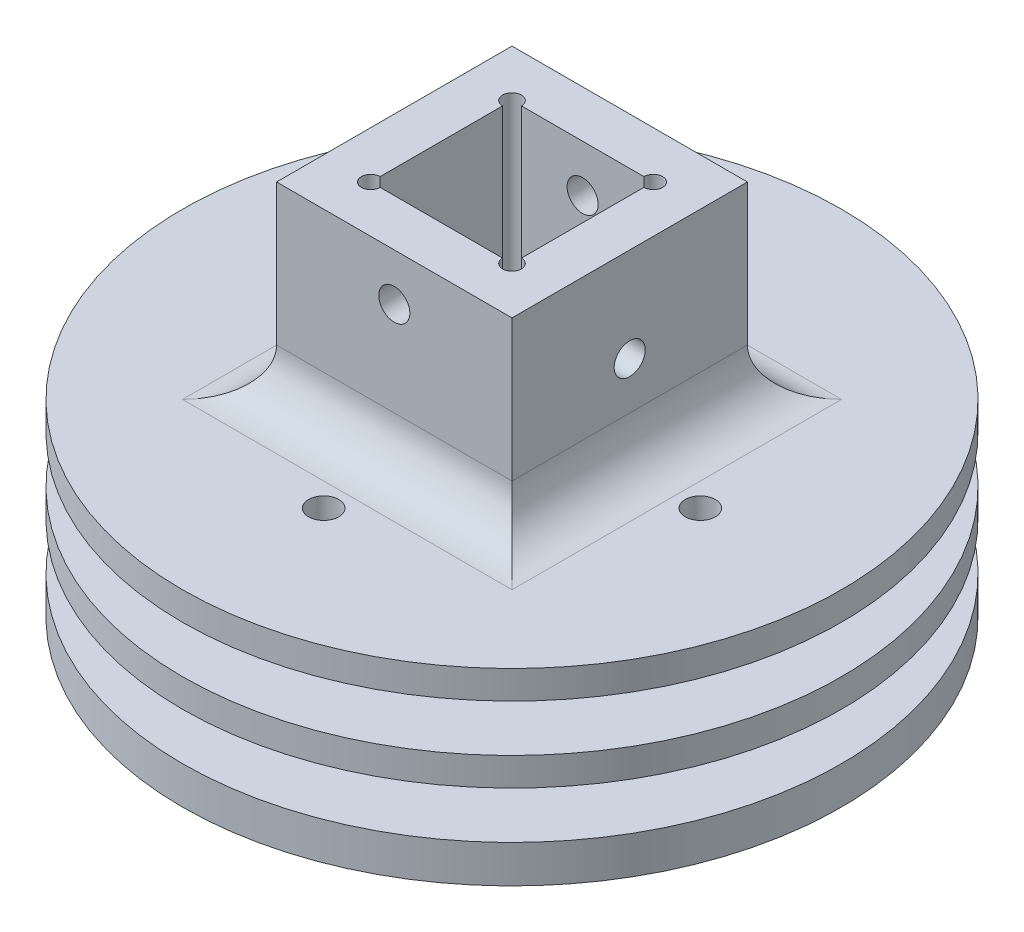
ISO-10303-21;
HEADER;
FILE_DESCRIPTION(('STEP AP214'),'2;1');
FILE_NAME('part.step','',(''),(''),'','','');
FILE_SCHEMA(('AUTOMOTIVE_DESIGN { 1 0 10303 214 1 1 1 1 }'));
ENDSEC;
DATA;
#1=APPLICATION_CONTEXT('core data for automotive mechanical design processes');
#2=APPLICATION_PROTOCOL_DEFINITION('international standard','automotive_design',2000,#1);
#3=PRODUCT_CONTEXT('',#1,'mechanical');
#4=PRODUCT('Part','Part','',(#3));
#5=PRODUCT_RELATED_PRODUCT_CATEGORY('part','',(#4));
#6=PRODUCT_DEFINITION_FORMATION('','',#4);
#7=PRODUCT_DEFINITION_CONTEXT('part definition',#1,'design');
#8=PRODUCT_DEFINITION('design','',#6,#7);
#9=PRODUCT_DEFINITION_SHAPE('','',#8);
#10=(LENGTH_UNIT() NAMED_UNIT(*) SI_UNIT(.MILLI.,.METRE.));
#11=(NAMED_UNIT(*) PLANE_ANGLE_UNIT() SI_UNIT($,.RADIAN.));
#12=(NAMED_UNIT(*) SI_UNIT($,.STERADIAN.) SOLID_ANGLE_UNIT());
#13=UNCERTAINTY_MEASURE_WITH_UNIT(LENGTH_MEASURE(1.E-05),#10,'distance_accuracy_value','');
#14=(GEOMETRIC_REPRESENTATION_CONTEXT(3) GLOBAL_UNCERTAINTY_ASSIGNED_CONTEXT((#13)) GLOBAL_UNIT_ASSIGNED_CONTEXT((#10,
#11,#12)) REPRESENTATION_CONTEXT('',''));
#15=CARTESIAN_POINT('',(0.,0.,0.));
#16=DIRECTION('',(0.,0.,1.));
#17=DIRECTION('',(1.,0.,0.));
#18=AXIS2_PLACEMENT_3D('',#15,#16,#17);
#19=CARTESIAN_POINT('',(0.,20.,0.));
#20=DIRECTION('',(0.,1.,0.));
#21=DIRECTION('',(0.,0.,1.));
#22=AXIS2_PLACEMENT_3D('',#19,#20,#21);
#23=PLANE('',#22);
#24=DIRECTION('',(-1.,0.,0.));
#25=VECTOR('',#24,1.);
#26=CARTESIAN_POINT('',(0.,20.,-17.5));
#27=LINE('',#26,#25);
#28=CARTESIAN_POINT('',(-17.5,20.,-17.5));
#29=VERTEX_POINT('',#28);
#30=CARTESIAN_POINT('',(17.5,20.,-17.5));
#31=VERTEX_POINT('',#30);
#32=EDGE_CURVE('E264',#29,#31,#27,.F.);
#33=ORIENTED_EDGE('',*,*,#32,.T.);
#34=DIRECTION('',(0.,0.,-1.));
#35=VECTOR('',#34,1.);
#36=CARTESIAN_POINT('',(17.5,20.,0.));
#37=LINE('',#36,#35);
#38=CARTESIAN_POINT('',(17.5,20.,17.5));
#39=VERTEX_POINT('',#38);
#40=EDGE_CURVE('E270',#31,#39,#37,.F.);
#41=ORIENTED_EDGE('',*,*,#40,.T.);
#42=DIRECTION('',(1.,0.,0.));
#43=VECTOR('',#42,1.);
#44=CARTESIAN_POINT('',(0.,20.,17.5));
#45=LINE('',#44,#43);
#46=CARTESIAN_POINT('',(-17.5,20.,17.5));
#47=VERTEX_POINT('',#46);
#48=EDGE_CURVE('E268',#39,#47,#45,.F.);
#49=ORIENTED_EDGE('',*,*,#48,.T.);
#50=DIRECTION('',(0.,0.,1.));
#51=VECTOR('',#50,1.);
#52=CARTESIAN_POINT('',(-17.5,20.,0.));
#53=LINE('',#52,#51);
#54=EDGE_CURVE('E266',#47,#29,#53,.F.);
#55=ORIENTED_EDGE('',*,*,#54,.T.);
#56=EDGE_LOOP('',(#33,#41,#49,#55));
#57=FACE_BOUND('',#56,.T.);
#58=CARTESIAN_POINT('',(0.,20.,0.));
#59=DIRECTION('',(0.,1.,0.));
#60=DIRECTION('',(0.,0.,1.));
#61=AXIS2_PLACEMENT_3D('',#58,#59,#60);
#62=CIRCLE('',#61,35.);
#63=CARTESIAN_POINT('',(0.,20.,35.));
#64=VERTEX_POINT('',#63);
#65=EDGE_CURVE('E232',#64,#64,#62,.T.);
#66=ORIENTED_EDGE('',*,*,#65,.T.);
#67=EDGE_LOOP('',(#66));
#68=FACE_BOUND('',#67,.T.);
#69=CARTESIAN_POINT('',(20.,20.,0.));
#70=DIRECTION('',(0.,1.,0.));
#71=DIRECTION('',(0.,0.,1.));
#72=AXIS2_PLACEMENT_3D('',#69,#70,#71);
#73=CIRCLE('',#72,1.6);
#74=CARTESIAN_POINT('',(20.,20.,1.6));
#75=VERTEX_POINT('',#74);
#76=EDGE_CURVE('E227',#75,#75,#73,.F.);
#77=ORIENTED_EDGE('',*,*,#76,.T.);
#78=EDGE_LOOP('',(#77));
#79=FACE_BOUND('',#78,.T.);
#80=CARTESIAN_POINT('',(0.,20.,-20.));
#81=DIRECTION('',(0.,1.,0.));
#82=DIRECTION('',(0.,0.,1.));
#83=AXIS2_PLACEMENT_3D('',#80,#81,#82);
#84=CIRCLE('',#83,1.6);
#85=CARTESIAN_POINT('',(0.,20.,-18.4));
#86=VERTEX_POINT('',#85);
#87=EDGE_CURVE('E221',#86,#86,#84,.F.);
#88=ORIENTED_EDGE('',*,*,#87,.T.);
#89=EDGE_LOOP('',(#88));
#90=FACE_BOUND('',#89,.T.);
#91=CARTESIAN_POINT('',(0.,20.,20.));
#92=DIRECTION('',(0.,1.,0.));
#93=DIRECTION('',(0.,0.,1.));
#94=AXIS2_PLACEMENT_3D('',#91,#92,#93);
#95=CIRCLE('',#94,1.6);
#96=CARTESIAN_POINT('',(0.,20.,21.6));
#97=VERTEX_POINT('',#96);
#98=EDGE_CURVE('E215',#97,#97,#95,.F.);
#99=ORIENTED_EDGE('',*,*,#98,.T.);
#100=EDGE_LOOP('',(#99));
#101=FACE_BOUND('',#100,.T.);
#102=CARTESIAN_POINT('',(-20.,20.,0.));
#103=DIRECTION('',(0.,1.,0.));
#104=DIRECTION('',(0.,0.,1.));
#105=AXIS2_PLACEMENT_3D('',#102,#103,#104);
#106=CIRCLE('',#105,1.6);
#107=CARTESIAN_POINT('',(-20.,20.,1.6));
#108=VERTEX_POINT('',#107);
#109=EDGE_CURVE('E212',#108,#108,#106,.F.);
#110=ORIENTED_EDGE('',*,*,#109,.T.);
#111=EDGE_LOOP('',(#110));
#112=FACE_BOUND('',#111,.T.);
#113=ADVANCED_FACE('F39',(#57,#68,#79,#90,#101,#112),#23,.T.);
#114=CARTESIAN_POINT('',(0.,4.,0.));
#115=DIRECTION('',(0.,-1.,0.));
#116=DIRECTION('',(0.,0.,-1.));
#117=AXIS2_PLACEMENT_3D('',#114,#115,#116);
#118=CYLINDRICAL_SURFACE('',#117,35.);
#119=CARTESIAN_POINT('',(0.,4.,0.));
#120=DIRECTION('',(0.,1.,0.));
#121=DIRECTION('',(0.,0.,1.));
#122=AXIS2_PLACEMENT_3D('',#119,#120,#121);
#123=CIRCLE('',#122,35.);
#124=CARTESIAN_POINT('',(0.,4.,35.));
#125=VERTEX_POINT('',#124);
#126=EDGE_CURVE('E257',#125,#125,#123,.T.);
#127=ORIENTED_EDGE('',*,*,#126,.F.);
#128=EDGE_LOOP('',(#127));
#129=FACE_BOUND('',#128,.T.);
#130=CARTESIAN_POINT('',(0.,0.,0.));
#131=DIRECTION('',(0.,1.,0.));
#132=DIRECTION('',(0.,0.,1.));
#133=AXIS2_PLACEMENT_3D('',#130,#131,#132);
#134=CIRCLE('',#133,35.);
#135=CARTESIAN_POINT('',(0.,0.,35.));
#136=VERTEX_POINT('',#135);
#137=EDGE_CURVE('E254',#136,#136,#134,.T.);
#138=ORIENTED_EDGE('',*,*,#137,.T.);
#139=EDGE_LOOP('',(#138));
#140=FACE_BOUND('',#139,.T.);
#141=ADVANCED_FACE('F365',(#129,#140),#118,.T.);
#142=CARTESIAN_POINT('',(0.,4.,0.));
#143=DIRECTION('',(0.,1.,0.));
#144=DIRECTION('',(0.,0.,1.));
#145=AXIS2_PLACEMENT_3D('',#142,#143,#144);
#146=PLANE('',#145);
#147=CARTESIAN_POINT('',(0.,4.,0.));
#148=DIRECTION('',(0.,1.,0.));
#149=DIRECTION('',(0.,0.,1.));
#150=AXIS2_PLACEMENT_3D('',#147,#148,#149);
#151=CIRCLE('',#150,25.);
#152=CARTESIAN_POINT('',(0.,4.,25.));
#153=VERTEX_POINT('',#152);
#154=EDGE_CURVE('E245',#153,#153,#151,.T.);
#155=ORIENTED_EDGE('',*,*,#154,.F.);
#156=EDGE_LOOP('',(#155));
#157=FACE_BOUND('',#156,.T.);
#158=ORIENTED_EDGE('',*,*,#126,.T.);
#159=EDGE_LOOP('',(#158));
#160=FACE_BOUND('',#159,.T.);
#161=ADVANCED_FACE('F373',(#157,#160),#146,.T.);
#162=CARTESIAN_POINT('',(0.,0.,0.));
#163=DIRECTION('',(0.,1.,0.));
#164=DIRECTION('',(0.,0.,1.));
#165=AXIS2_PLACEMENT_3D('',#162,#163,#164);
#166=PLANE('',#165);
#167=CARTESIAN_POINT('',(0.,0.,0.));
#168=DIRECTION('',(0.,-1.,0.));
#169=DIRECTION('',(0.,0.,-1.));
#170=AXIS2_PLACEMENT_3D('',#167,#168,#169);
#171=CIRCLE('',#170,10.);
#172=CARTESIAN_POINT('',(0.,0.,-10.));
#173=VERTEX_POINT('',#172);
#174=EDGE_CURVE('E201',#173,#173,#171,.T.);
#175=ORIENTED_EDGE('',*,*,#174,.F.);
#176=EDGE_LOOP('',(#175));
#177=FACE_BOUND('',#176,.T.);
#178=CARTESIAN_POINT('',(-20.,0.,0.));
#179=DIRECTION('',(0.,-1.,0.));
#180=DIRECTION('',(0.,0.,-1.));
#181=AXIS2_PLACEMENT_3D('',#178,#179,#180);
#182=CIRCLE('',#181,1.6);
#183=CARTESIAN_POINT('',(-20.,0.,-1.6));
#184=VERTEX_POINT('',#183);
#185=EDGE_CURVE('E208',#184,#184,#182,.T.);
#186=ORIENTED_EDGE('',*,*,#185,.F.);
#187=EDGE_LOOP('',(#186));
#188=FACE_BOUND('',#187,.T.);
#189=CARTESIAN_POINT('',(0.,0.,20.));
#190=DIRECTION('',(0.,-1.,0.));
#191=DIRECTION('',(0.,0.,-1.));
#192=AXIS2_PLACEMENT_3D('',#189,#190,#191);
#193=CIRCLE('',#192,1.6);
#194=CARTESIAN_POINT('',(0.,0.,18.4));
#195=VERTEX_POINT('',#194);
#196=EDGE_CURVE('E218',#195,#195,#193,.T.);
#197=ORIENTED_EDGE('',*,*,#196,.F.);
#198=EDGE_LOOP('',(#197));
#199=FACE_BOUND('',#198,.T.);
#200=CARTESIAN_POINT('',(0.,0.,-20.));
#201=DIRECTION('',(0.,-1.,0.));
#202=DIRECTION('',(0.,0.,-1.));
#203=AXIS2_PLACEMENT_3D('',#200,#201,#202);
#204=CIRCLE('',#203,1.6);
#205=CARTESIAN_POINT('',(0.,0.,-21.6));
#206=VERTEX_POINT('',#205);
#207=EDGE_CURVE('E224',#206,#206,#204,.T.);
#208=ORIENTED_EDGE('',*,*,#207,.F.);
#209=EDGE_LOOP('',(#208));
#210=FACE_BOUND('',#209,.T.);
#211=CARTESIAN_POINT('',(20.,0.,0.));
#212=DIRECTION('',(0.,-1.,0.));
#213=DIRECTION('',(0.,0.,-1.));
#214=AXIS2_PLACEMENT_3D('',#211,#212,#213);
#215=CIRCLE('',#214,1.6);
#216=CARTESIAN_POINT('',(20.,0.,-1.6));
#217=VERTEX_POINT('',#216);
#218=EDGE_CURVE('E205',#217,#217,#215,.T.);
#219=ORIENTED_EDGE('',*,*,#218,.F.);
#220=EDGE_LOOP('',(#219));
#221=FACE_BOUND('',#220,.T.);
#222=ORIENTED_EDGE('',*,*,#137,.F.);
#223=EDGE_LOOP('',(#222));
#224=FACE_BOUND('',#223,.T.);
#225=ADVANCED_FACE('F452',(#177,#188,#199,#210,#221,#224),#166,.F.);
#226=CARTESIAN_POINT('',(0.,9.,0.));
#227=DIRECTION('',(0.,-1.,0.));
#228=DIRECTION('',(0.,0.,-1.));
#229=AXIS2_PLACEMENT_3D('',#226,#227,#228);
#230=CYLINDRICAL_SURFACE('',#229,25.);
#231=CARTESIAN_POINT('',(0.,9.,0.));
#232=DIRECTION('',(0.,1.,0.));
#233=DIRECTION('',(0.,0.,1.));
#234=AXIS2_PLACEMENT_3D('',#231,#232,#233);
#235=CIRCLE('',#234,25.);
#236=CARTESIAN_POINT('',(0.,9.,25.));
#237=VERTEX_POINT('',#236);
#238=EDGE_CURVE('E249',#237,#237,#235,.T.);
#239=ORIENTED_EDGE('',*,*,#238,.F.);
#240=EDGE_LOOP('',(#239));
#241=FACE_BOUND('',#240,.T.);
#242=ORIENTED_EDGE('',*,*,#154,.T.);
#243=EDGE_LOOP('',(#242));
#244=FACE_BOUND('',#243,.T.);
#245=ADVANCED_FACE('F455',(#241,#244),#230,.T.);
#246=CARTESIAN_POINT('',(0.,12.,0.));
#247=DIRECTION('',(0.,-1.,0.));
#248=DIRECTION('',(0.,0.,-1.));
#249=AXIS2_PLACEMENT_3D('',#246,#247,#248);
#250=CYLINDRICAL_SURFACE('',#249,35.);
#251=CARTESIAN_POINT('',(0.,12.,0.));
#252=DIRECTION('',(0.,1.,0.));
#253=DIRECTION('',(0.,0.,1.));
#254=AXIS2_PLACEMENT_3D('',#251,#252,#253);
#255=CIRCLE('',#254,35.);
#256=CARTESIAN_POINT('',(0.,12.,35.));
#257=VERTEX_POINT('',#256);
#258=EDGE_CURVE('E246',#257,#257,#255,.T.);
#259=ORIENTED_EDGE('',*,*,#258,.F.);
#260=EDGE_LOOP('',(#259));
#261=FACE_BOUND('',#260,.T.);
#262=CARTESIAN_POINT('',(0.,9.,0.));
#263=DIRECTION('',(0.,1.,0.));
#264=DIRECTION('',(0.,0.,1.));
#265=AXIS2_PLACEMENT_3D('',#262,#263,#264);
#266=CIRCLE('',#265,35.);
#267=CARTESIAN_POINT('',(0.,9.,35.));
#268=VERTEX_POINT('',#267);
#269=EDGE_CURVE('E240',#268,#268,#266,.T.);
#270=ORIENTED_EDGE('',*,*,#269,.T.);
#271=EDGE_LOOP('',(#270));
#272=FACE_BOUND('',#271,.T.);
#273=ADVANCED_FACE('F463',(#261,#272),#250,.T.);
#274=CARTESIAN_POINT('',(0.,12.,0.));
#275=DIRECTION('',(0.,1.,0.));
#276=DIRECTION('',(0.,0.,1.));
#277=AXIS2_PLACEMENT_3D('',#274,#275,#276);
#278=PLANE('',#277);
#279=CARTESIAN_POINT('',(0.,12.,0.));
#280=DIRECTION('',(0.,1.,0.));
#281=DIRECTION('',(0.,0.,1.));
#282=AXIS2_PLACEMENT_3D('',#279,#280,#281);
#283=CIRCLE('',#282,25.);
#284=CARTESIAN_POINT('',(0.,12.,25.));
#285=VERTEX_POINT('',#284);
#286=EDGE_CURVE('E241',#285,#285,#283,.T.);
#287=ORIENTED_EDGE('',*,*,#286,.F.);
#288=EDGE_LOOP('',(#287));
#289=FACE_BOUND('',#288,.T.);
#290=ORIENTED_EDGE('',*,*,#258,.T.);
#291=EDGE_LOOP('',(#290));
#292=FACE_BOUND('',#291,.T.);
#293=ADVANCED_FACE('F650',(#289,#292),#278,.T.);
#294=CARTESIAN_POINT('',(0.,9.,0.));
#295=DIRECTION('',(0.,1.,0.));
#296=DIRECTION('',(0.,0.,1.));
#297=AXIS2_PLACEMENT_3D('',#294,#295,#296);
#298=PLANE('',#297);
#299=ORIENTED_EDGE('',*,*,#238,.T.);
#300=EDGE_LOOP('',(#299));
#301=FACE_BOUND('',#300,.T.);
#302=ORIENTED_EDGE('',*,*,#269,.F.);
#303=EDGE_LOOP('',(#302));
#304=FACE_BOUND('',#303,.T.);
#305=ADVANCED_FACE('F643',(#301,#304),#298,.F.);
#306=CARTESIAN_POINT('',(0.,17.,0.));
#307=DIRECTION('',(0.,-1.,0.));
#308=DIRECTION('',(0.,0.,-1.));
#309=AXIS2_PLACEMENT_3D('',#306,#307,#308);
#310=CYLINDRICAL_SURFACE('',#309,25.);
#311=CARTESIAN_POINT('',(0.,17.,0.));
#312=DIRECTION('',(0.,1.,0.));
#313=DIRECTION('',(0.,0.,1.));
#314=AXIS2_PLACEMENT_3D('',#311,#312,#313);
#315=CIRCLE('',#314,25.);
#316=CARTESIAN_POINT('',(0.,17.,25.));
#317=VERTEX_POINT('',#316);
#318=EDGE_CURVE('E235',#317,#317,#315,.T.);
#319=ORIENTED_EDGE('',*,*,#318,.F.);
#320=EDGE_LOOP('',(#319));
#321=FACE_BOUND('',#320,.T.);
#322=ORIENTED_EDGE('',*,*,#286,.T.);
#323=EDGE_LOOP('',(#322));
#324=FACE_BOUND('',#323,.T.);
#325=ADVANCED_FACE('F634',(#321,#324),#310,.T.);
#326=CARTESIAN_POINT('',(0.,20.,0.));
#327=DIRECTION('',(0.,-1.,0.));
#328=DIRECTION('',(0.,0.,-1.));
#329=AXIS2_PLACEMENT_3D('',#326,#327,#328);
#330=CYLINDRICAL_SURFACE('',#329,35.);
#331=ORIENTED_EDGE('',*,*,#65,.F.);
#332=EDGE_LOOP('',(#331));
#333=FACE_BOUND('',#332,.T.);
#334=CARTESIAN_POINT('',(0.,17.,0.));
#335=DIRECTION('',(0.,1.,0.));
#336=DIRECTION('',(0.,0.,1.));
#337=AXIS2_PLACEMENT_3D('',#334,#335,#336);
#338=CIRCLE('',#337,35.);
#339=CARTESIAN_POINT('',(0.,17.,35.));
#340=VERTEX_POINT('',#339);
#341=EDGE_CURVE('E211',#340,#340,#338,.T.);
#342=ORIENTED_EDGE('',*,*,#341,.T.);
#343=EDGE_LOOP('',(#342));
#344=FACE_BOUND('',#343,.T.);
#345=ADVANCED_FACE('F446',(#333,#344),#330,.T.);
#346=CARTESIAN_POINT('',(0.,17.,0.));
#347=DIRECTION('',(0.,1.,0.));
#348=DIRECTION('',(0.,0.,1.));
#349=AXIS2_PLACEMENT_3D('',#346,#347,#348);
#350=PLANE('',#349);
#351=ORIENTED_EDGE('',*,*,#318,.T.);
#352=EDGE_LOOP('',(#351));
#353=FACE_BOUND('',#352,.T.);
#354=ORIENTED_EDGE('',*,*,#341,.F.);
#355=EDGE_LOOP('',(#354));
#356=FACE_BOUND('',#355,.T.);
#357=ADVANCED_FACE('F441',(#353,#356),#350,.F.);
#358=CARTESIAN_POINT('',(20.,20.001,0.));
#359=DIRECTION('',(0.,-1.,0.));
#360=DIRECTION('',(0.,0.,-1.));
#361=AXIS2_PLACEMENT_3D('',#358,#359,#360);
#362=CYLINDRICAL_SURFACE('',#361,1.6);
#363=ORIENTED_EDGE('',*,*,#76,.F.);
#364=EDGE_LOOP('',(#363));
#365=FACE_BOUND('',#364,.T.);
#366=ORIENTED_EDGE('',*,*,#218,.T.);
#367=EDGE_LOOP('',(#366));
#368=FACE_BOUND('',#367,.T.);
#369=ADVANCED_FACE('F438',(#365,#368),#362,.F.);
#370=CARTESIAN_POINT('',(0.,20.001,-20.));
#371=DIRECTION('',(0.,-1.,0.));
#372=DIRECTION('',(0.,0.,-1.));
#373=AXIS2_PLACEMENT_3D('',#370,#371,#372);
#374=CYLINDRICAL_SURFACE('',#373,1.6);
#375=ORIENTED_EDGE('',*,*,#87,.F.);
#376=EDGE_LOOP('',(#375));
#377=FACE_BOUND('',#376,.T.);
#378=ORIENTED_EDGE('',*,*,#207,.T.);
#379=EDGE_LOOP('',(#378));
#380=FACE_BOUND('',#379,.T.);
#381=ADVANCED_FACE('F435',(#377,#380),#374,.F.);
#382=CARTESIAN_POINT('',(0.,20.001,20.));
#383=DIRECTION('',(0.,-1.,0.));
#384=DIRECTION('',(0.,0.,-1.));
#385=AXIS2_PLACEMENT_3D('',#382,#383,#384);
#386=CYLINDRICAL_SURFACE('',#385,1.6);
#387=ORIENTED_EDGE('',*,*,#98,.F.);
#388=EDGE_LOOP('',(#387));
#389=FACE_BOUND('',#388,.T.);
#390=ORIENTED_EDGE('',*,*,#196,.T.);
#391=EDGE_LOOP('',(#390));
#392=FACE_BOUND('',#391,.T.);
#393=ADVANCED_FACE('F431',(#389,#392),#386,.F.);
#394=CARTESIAN_POINT('',(-20.,20.001,0.));
#395=DIRECTION('',(0.,-1.,0.));
#396=DIRECTION('',(0.,0.,-1.));
#397=AXIS2_PLACEMENT_3D('',#394,#395,#396);
#398=CYLINDRICAL_SURFACE('',#397,1.6);
#399=ORIENTED_EDGE('',*,*,#109,.F.);
#400=EDGE_LOOP('',(#399));
#401=FACE_BOUND('',#400,.T.);
#402=ORIENTED_EDGE('',*,*,#185,.T.);
#403=EDGE_LOOP('',(#402));
#404=FACE_BOUND('',#403,.T.);
#405=ADVANCED_FACE('F427',(#401,#404),#398,.F.);
#406=CARTESIAN_POINT('',(0.,5.,0.));
#407=DIRECTION('',(0.,-1.,0.));
#408=DIRECTION('',(0.,0.,-1.));
#409=AXIS2_PLACEMENT_3D('',#406,#407,#408);
#410=CYLINDRICAL_SURFACE('',#409,10.);
#411=CARTESIAN_POINT('',(0.,5.,0.));
#412=DIRECTION('',(0.,-1.,0.));
#413=DIRECTION('',(0.,0.,-1.));
#414=AXIS2_PLACEMENT_3D('',#411,#412,#413);
#415=CIRCLE('',#414,10.);
#416=CARTESIAN_POINT('',(0.,5.,-10.));
#417=VERTEX_POINT('',#416);
#418=EDGE_CURVE('E202',#417,#417,#415,.T.);
#419=ORIENTED_EDGE('',*,*,#418,.F.);
#420=EDGE_LOOP('',(#419));
#421=FACE_BOUND('',#420,.T.);
#422=ORIENTED_EDGE('',*,*,#174,.T.);
#423=EDGE_LOOP('',(#422));
#424=FACE_BOUND('',#423,.T.);
#425=ADVANCED_FACE('F423',(#421,#424),#410,.F.);
#426=CARTESIAN_POINT('',(0.,5.,0.));
#427=DIRECTION('',(0.,-1.,0.));
#428=DIRECTION('',(0.,0.,-1.));
#429=AXIS2_PLACEMENT_3D('',#426,#427,#428);
#430=PLANE('',#429);
#431=ORIENTED_EDGE('',*,*,#418,.T.);
#432=EDGE_LOOP('',(#431));
#433=FACE_BOUND('',#432,.T.);
#434=ADVANCED_FACE('F405',(#433),#430,.T.);
#435=CARTESIAN_POINT('',(0.,40.,0.));
#436=DIRECTION('',(0.,-1.,0.));
#437=DIRECTION('',(0.,0.,-1.));
#438=AXIS2_PLACEMENT_3D('',#435,#436,#437);
#439=PLANE('',#438);
#440=DIRECTION('',(0.,0.,-1.));
#441=VECTOR('',#440,1.);
#442=CARTESIAN_POINT('',(12.5,40.,12.5));
#443=LINE('',#442,#441);
#444=CARTESIAN_POINT('',(12.5,40.,12.5));
#445=VERTEX_POINT('',#444);
#446=CARTESIAN_POINT('',(12.5,40.,-12.5));
#447=VERTEX_POINT('',#446);
#448=EDGE_CURVE('E183',#445,#447,#443,.T.);
#449=ORIENTED_EDGE('',*,*,#448,.T.);
#450=DIRECTION('',(-1.,0.,0.));
#451=VECTOR('',#450,1.);
#452=CARTESIAN_POINT('',(-12.5,40.,-12.5));
#453=LINE('',#452,#451);
#454=CARTESIAN_POINT('',(-12.5,40.,-12.5));
#455=VERTEX_POINT('',#454);
#456=EDGE_CURVE('E186',#447,#455,#453,.T.);
#457=ORIENTED_EDGE('',*,*,#456,.T.);
#458=DIRECTION('',(0.,0.,1.));
#459=VECTOR('',#458,1.);
#460=CARTESIAN_POINT('',(-12.5,40.,12.5));
#461=LINE('',#460,#459);
#462=CARTESIAN_POINT('',(-12.5,40.,12.5));
#463=VERTEX_POINT('',#462);
#464=EDGE_CURVE('E188',#455,#463,#461,.T.);
#465=ORIENTED_EDGE('',*,*,#464,.T.);
#466=DIRECTION('',(1.,0.,0.));
#467=VECTOR('',#466,1.);
#468=CARTESIAN_POINT('',(-12.5,40.,12.5));
#469=LINE('',#468,#467);
#470=EDGE_CURVE('E190',#463,#445,#469,.T.);
#471=ORIENTED_EDGE('',*,*,#470,.T.);
#472=EDGE_LOOP('',(#449,#457,#465,#471));
#473=FACE_BOUND('',#472,.T.);
#474=DIRECTION('',(0.,0.,-1.));
#475=VECTOR('',#474,1.);
#476=CARTESIAN_POINT('',(7.5,40.,7.5));
#477=LINE('',#476,#475);
#478=CARTESIAN_POINT('',(7.5,40.,6.5));
#479=VERTEX_POINT('',#478);
#480=CARTESIAN_POINT('',(7.5,40.,-6.5));
#481=VERTEX_POINT('',#480);
#482=EDGE_CURVE('E161',#479,#481,#477,.T.);
#483=ORIENTED_EDGE('',*,*,#482,.F.);
#484=CARTESIAN_POINT('',(7.5,40.,7.5));
#485=DIRECTION('',(0.,1.,0.));
#486=DIRECTION('',(0.,0.,1.));
#487=AXIS2_PLACEMENT_3D('',#484,#485,#486);
#488=CIRCLE('',#487,1.);
#489=CARTESIAN_POINT('',(6.5,40.,7.5));
#490=VERTEX_POINT('',#489);
#491=EDGE_CURVE('E313',#490,#479,#488,.T.);
#492=ORIENTED_EDGE('',*,*,#491,.F.);
#493=DIRECTION('',(1.,0.,0.));
#494=VECTOR('',#493,1.);
#495=CARTESIAN_POINT('',(-7.5,40.,7.5));
#496=LINE('',#495,#494);
#497=CARTESIAN_POINT('',(-6.5,40.,7.5));
#498=VERTEX_POINT('',#497);
#499=EDGE_CURVE('E176',#498,#490,#496,.T.);
#500=ORIENTED_EDGE('',*,*,#499,.F.);
#501=CARTESIAN_POINT('',(-7.5,40.,7.5));
#502=DIRECTION('',(0.,1.,0.));
#503=DIRECTION('',(0.,0.,1.));
#504=AXIS2_PLACEMENT_3D('',#501,#502,#503);
#505=CIRCLE('',#504,1.);
#506=CARTESIAN_POINT('',(-7.5,40.,6.5));
#507=VERTEX_POINT('',#506);
#508=EDGE_CURVE('E309',#507,#498,#505,.T.);
#509=ORIENTED_EDGE('',*,*,#508,.F.);
#510=DIRECTION('',(0.,0.,1.));
#511=VECTOR('',#510,1.);
#512=CARTESIAN_POINT('',(-7.5,40.,7.5));
#513=LINE('',#512,#511);
#514=CARTESIAN_POINT('',(-7.5,40.,-6.5));
#515=VERTEX_POINT('',#514);
#516=EDGE_CURVE('E332',#515,#507,#513,.T.);
#517=ORIENTED_EDGE('',*,*,#516,.F.);
#518=CARTESIAN_POINT('',(-7.5,40.,-7.5));
#519=DIRECTION('',(0.,1.,0.));
#520=DIRECTION('',(0.,0.,1.));
#521=AXIS2_PLACEMENT_3D('',#518,#519,#520);
#522=CIRCLE('',#521,1.);
#523=CARTESIAN_POINT('',(-6.5,40.,-7.5));
#524=VERTEX_POINT('',#523);
#525=EDGE_CURVE('E308',#524,#515,#522,.T.);
#526=ORIENTED_EDGE('',*,*,#525,.F.);
#527=DIRECTION('',(-1.,0.,0.));
#528=VECTOR('',#527,1.);
#529=CARTESIAN_POINT('',(-7.5,40.,-7.5));
#530=LINE('',#529,#528);
#531=CARTESIAN_POINT('',(6.5,40.,-7.5));
#532=VERTEX_POINT('',#531);
#533=EDGE_CURVE('E330',#532,#524,#530,.T.);
#534=ORIENTED_EDGE('',*,*,#533,.F.);
#535=CARTESIAN_POINT('',(7.5,40.,-7.5));
#536=DIRECTION('',(0.,1.,0.));
#537=DIRECTION('',(0.,0.,1.));
#538=AXIS2_PLACEMENT_3D('',#535,#536,#537);
#539=CIRCLE('',#538,1.);
#540=EDGE_CURVE('E152',#481,#532,#539,.T.);
#541=ORIENTED_EDGE('',*,*,#540,.F.);
#542=EDGE_LOOP('',(#483,#492,#500,#509,#517,#526,#534,#541));
#543=FACE_BOUND('',#542,.T.);
#544=ADVANCED_FACE('F348',(#473,#543),#439,.F.);
#545=CARTESIAN_POINT('',(12.5,40.,12.5));
#546=DIRECTION('',(-1.,0.,0.));
#547=DIRECTION('',(0.,0.,1.));
#548=AXIS2_PLACEMENT_3D('',#545,#546,#547);
#549=PLANE('',#548);
#550=CARTESIAN_POINT('',(12.5,30.,0.));
#551=DIRECTION('',(1.,0.,0.));
#552=DIRECTION('',(0.,0.,-1.));
#553=AXIS2_PLACEMENT_3D('',#550,#551,#552);
#554=CIRCLE('',#553,1.65);
#555=CARTESIAN_POINT('',(12.5,30.,-1.65));
#556=VERTEX_POINT('',#555);
#557=EDGE_CURVE('E289',#556,#556,#554,.T.);
#558=ORIENTED_EDGE('',*,*,#557,.F.);
#559=EDGE_LOOP('',(#558));
#560=FACE_BOUND('',#559,.T.);
#561=DIRECTION('',(0.,-1.,0.));
#562=VECTOR('',#561,1.);
#563=CARTESIAN_POINT('',(12.5,40.,12.5));
#564=LINE('',#563,#562);
#565=CARTESIAN_POINT('',(12.5,25.,12.5));
#566=VERTEX_POINT('',#565);
#567=EDGE_CURVE('E192',#445,#566,#564,.T.);
#568=ORIENTED_EDGE('',*,*,#567,.T.);
#569=DIRECTION('',(0.,0.,-1.));
#570=VECTOR('',#569,1.);
#571=CARTESIAN_POINT('',(12.5,25.,12.5));
#572=LINE('',#571,#570);
#573=CARTESIAN_POINT('',(12.5,25.,-12.5));
#574=VERTEX_POINT('',#573);
#575=EDGE_CURVE('E244',#566,#574,#572,.T.);
#576=ORIENTED_EDGE('',*,*,#575,.T.);
#577=DIRECTION('',(0.,-1.,0.));
#578=VECTOR('',#577,1.);
#579=CARTESIAN_POINT('',(12.5,40.,-12.5));
#580=LINE('',#579,#578);
#581=EDGE_CURVE('E199',#447,#574,#580,.T.);
#582=ORIENTED_EDGE('',*,*,#581,.F.);
#583=ORIENTED_EDGE('',*,*,#448,.F.);
#584=EDGE_LOOP('',(#568,#576,#582,#583));
#585=FACE_BOUND('',#584,.T.);
#586=ADVANCED_FACE('F404',(#560,#585),#549,.F.);
#587=CARTESIAN_POINT('',(-12.5,40.,-12.5));
#588=DIRECTION('',(0.,0.,1.));
#589=DIRECTION('',(1.,0.,0.));
#590=AXIS2_PLACEMENT_3D('',#587,#588,#589);
#591=PLANE('',#590);
#592=CARTESIAN_POINT('',(0.,35.,-12.5));
#593=DIRECTION('',(0.,0.,-1.));
#594=DIRECTION('',(-1.,0.,0.));
#595=AXIS2_PLACEMENT_3D('',#592,#593,#594);
#596=CIRCLE('',#595,1.65);
#597=CARTESIAN_POINT('',(-1.65,35.,-12.5));
#598=VERTEX_POINT('',#597);
#599=EDGE_CURVE('E790',#598,#598,#596,.T.);
#600=ORIENTED_EDGE('',*,*,#599,.F.);
#601=EDGE_LOOP('',(#600));
#602=FACE_BOUND('',#601,.T.);
#603=ORIENTED_EDGE('',*,*,#581,.T.);
#604=DIRECTION('',(-1.,0.,0.));
#605=VECTOR('',#604,1.);
#606=CARTESIAN_POINT('',(-12.5,25.,-12.5));
#607=LINE('',#606,#605);
#608=CARTESIAN_POINT('',(-12.5,25.,-12.5));
#609=VERTEX_POINT('',#608);
#610=EDGE_CURVE('E11',#574,#609,#607,.T.);
#611=ORIENTED_EDGE('',*,*,#610,.T.);
#612=DIRECTION('',(0.,-1.,0.));
#613=VECTOR('',#612,1.);
#614=CARTESIAN_POINT('',(-12.5,40.,-12.5));
#615=LINE('',#614,#613);
#616=EDGE_CURVE('E197',#455,#609,#615,.T.);
#617=ORIENTED_EDGE('',*,*,#616,.F.);
#618=ORIENTED_EDGE('',*,*,#456,.F.);
#619=EDGE_LOOP('',(#603,#611,#617,#618));
#620=FACE_BOUND('',#619,.T.);
#621=ADVANCED_FACE('F413',(#602,#620),#591,.F.);
#622=CARTESIAN_POINT('',(-12.5,40.,12.5));
#623=DIRECTION('',(1.,0.,0.));
#624=DIRECTION('',(0.,0.,-1.));
#625=AXIS2_PLACEMENT_3D('',#622,#623,#624);
#626=PLANE('',#625);
#627=CARTESIAN_POINT('',(-12.5,30.,0.));
#628=DIRECTION('',(1.,0.,0.));
#629=DIRECTION('',(0.,0.,-1.));
#630=AXIS2_PLACEMENT_3D('',#627,#628,#629);
#631=CIRCLE('',#630,1.65);
#632=CARTESIAN_POINT('',(-12.5,30.,-1.65));
#633=VERTEX_POINT('',#632);
#634=EDGE_CURVE('E279',#633,#633,#631,.T.);
#635=ORIENTED_EDGE('',*,*,#634,.T.);
#636=EDGE_LOOP('',(#635));
#637=FACE_BOUND('',#636,.T.);
#638=ORIENTED_EDGE('',*,*,#616,.T.);
#639=DIRECTION('',(0.,0.,1.));
#640=VECTOR('',#639,1.);
#641=CARTESIAN_POINT('',(-12.5,25.,12.5));
#642=LINE('',#641,#640);
#643=CARTESIAN_POINT('',(-12.5,25.,12.5));
#644=VERTEX_POINT('',#643);
#645=EDGE_CURVE('E48',#609,#644,#642,.T.);
#646=ORIENTED_EDGE('',*,*,#645,.T.);
#647=DIRECTION('',(0.,-1.,0.));
#648=VECTOR('',#647,1.);
#649=CARTESIAN_POINT('',(-12.5,40.,12.5));
#650=LINE('',#649,#648);
#651=EDGE_CURVE('E195',#463,#644,#650,.T.);
#652=ORIENTED_EDGE('',*,*,#651,.F.);
#653=ORIENTED_EDGE('',*,*,#464,.F.);
#654=EDGE_LOOP('',(#638,#646,#652,#653));
#655=FACE_BOUND('',#654,.T.);
#656=ADVANCED_FACE('F409',(#637,#655),#626,.F.);
#657=CARTESIAN_POINT('',(-12.5,40.,12.5));
#658=DIRECTION('',(0.,0.,-1.));
#659=DIRECTION('',(-1.,0.,0.));
#660=AXIS2_PLACEMENT_3D('',#657,#658,#659);
#661=PLANE('',#660);
#662=CARTESIAN_POINT('',(0.,35.,12.5));
#663=DIRECTION('',(0.,0.,-1.));
#664=DIRECTION('',(-1.,0.,0.));
#665=AXIS2_PLACEMENT_3D('',#662,#663,#664);
#666=CIRCLE('',#665,1.65);
#667=CARTESIAN_POINT('',(-1.65,35.,12.5));
#668=VERTEX_POINT('',#667);
#669=EDGE_CURVE('E295',#668,#668,#666,.T.);
#670=ORIENTED_EDGE('',*,*,#669,.T.);
#671=EDGE_LOOP('',(#670));
#672=FACE_BOUND('',#671,.T.);
#673=ORIENTED_EDGE('',*,*,#651,.T.);
#674=DIRECTION('',(1.,0.,0.));
#675=VECTOR('',#674,1.);
#676=CARTESIAN_POINT('',(-12.5,25.,12.5));
#677=LINE('',#676,#675);
#678=EDGE_CURVE('E273',#644,#566,#677,.T.);
#679=ORIENTED_EDGE('',*,*,#678,.T.);
#680=ORIENTED_EDGE('',*,*,#567,.F.);
#681=ORIENTED_EDGE('',*,*,#470,.F.);
#682=EDGE_LOOP('',(#673,#679,#680,#681));
#683=FACE_BOUND('',#682,.T.);
#684=ADVANCED_FACE('F401',(#672,#683),#661,.F.);
#685=CARTESIAN_POINT('',(7.5,40.,7.5));
#686=DIRECTION('',(-1.,0.,0.));
#687=DIRECTION('',(0.,0.,1.));
#688=AXIS2_PLACEMENT_3D('',#685,#686,#687);
#689=PLANE('',#688);
#690=CARTESIAN_POINT('',(7.5,30.,0.));
#691=DIRECTION('',(-1.,0.,0.));
#692=DIRECTION('',(0.,0.,1.));
#693=AXIS2_PLACEMENT_3D('',#690,#691,#692);
#694=CIRCLE('',#693,1.65);
#695=CARTESIAN_POINT('',(7.5,30.,1.64999999999999));
#696=VERTEX_POINT('',#695);
#697=EDGE_CURVE('E288',#696,#696,#694,.T.);
#698=ORIENTED_EDGE('',*,*,#697,.F.);
#699=EDGE_LOOP('',(#698));
#700=FACE_BOUND('',#699,.T.);
#701=DIRECTION('',(0.,1.,0.));
#702=VECTOR('',#701,1.);
#703=CARTESIAN_POINT('',(7.5,17.1715728752538,6.5));
#704=LINE('',#703,#702);
#705=CARTESIAN_POINT('',(7.5,20.,6.5));
#706=VERTEX_POINT('',#705);
#707=EDGE_CURVE('E169',#479,#706,#704,.F.);
#708=ORIENTED_EDGE('',*,*,#707,.F.);
#709=ORIENTED_EDGE('',*,*,#482,.T.);
#710=DIRECTION('',(0.,1.,0.));
#711=VECTOR('',#710,1.);
#712=CARTESIAN_POINT('',(7.5,17.1715728752538,-6.5));
#713=LINE('',#712,#711);
#714=CARTESIAN_POINT('',(7.5,20.,-6.5));
#715=VERTEX_POINT('',#714);
#716=EDGE_CURVE('E144',#715,#481,#713,.T.);
#717=ORIENTED_EDGE('',*,*,#716,.F.);
#718=DIRECTION('',(0.,0.,-1.));
#719=VECTOR('',#718,1.);
#720=CARTESIAN_POINT('',(7.5,20.,7.5));
#721=LINE('',#720,#719);
#722=EDGE_CURVE('E159',#706,#715,#721,.T.);
#723=ORIENTED_EDGE('',*,*,#722,.F.);
#724=EDGE_LOOP('',(#708,#709,#717,#723));
#725=FACE_BOUND('',#724,.T.);
#726=ADVANCED_FACE('F158',(#700,#725),#689,.T.);
#727=CARTESIAN_POINT('',(-7.5,40.,-7.5));
#728=DIRECTION('',(0.,0.,1.));
#729=DIRECTION('',(1.,0.,0.));
#730=AXIS2_PLACEMENT_3D('',#727,#728,#729);
#731=PLANE('',#730);
#732=CARTESIAN_POINT('',(0.,35.,-7.5));
#733=DIRECTION('',(0.,0.,1.));
#734=DIRECTION('',(1.,0.,0.));
#735=AXIS2_PLACEMENT_3D('',#732,#733,#734);
#736=CIRCLE('',#735,1.65);
#737=CARTESIAN_POINT('',(1.64999999999999,35.,-7.5));
#738=VERTEX_POINT('',#737);
#739=EDGE_CURVE('E300',#738,#738,#736,.T.);
#740=ORIENTED_EDGE('',*,*,#739,.F.);
#741=EDGE_LOOP('',(#740));
#742=FACE_BOUND('',#741,.T.);
#743=DIRECTION('',(0.,1.,0.));
#744=VECTOR('',#743,1.);
#745=CARTESIAN_POINT('',(-6.5,17.1715728752538,-7.5));
#746=LINE('',#745,#744);
#747=CARTESIAN_POINT('',(-6.5,20.,-7.5));
#748=VERTEX_POINT('',#747);
#749=EDGE_CURVE('E321',#748,#524,#746,.T.);
#750=ORIENTED_EDGE('',*,*,#749,.F.);
#751=DIRECTION('',(-1.,0.,0.));
#752=VECTOR('',#751,1.);
#753=CARTESIAN_POINT('',(-7.5,20.,-7.5));
#754=LINE('',#753,#752);
#755=CARTESIAN_POINT('',(6.5,20.,-7.5));
#756=VERTEX_POINT('',#755);
#757=EDGE_CURVE('E168',#756,#748,#754,.T.);
#758=ORIENTED_EDGE('',*,*,#757,.F.);
#759=DIRECTION('',(0.,1.,0.));
#760=VECTOR('',#759,1.);
#761=CARTESIAN_POINT('',(6.5,17.1715728752538,-7.5));
#762=LINE('',#761,#760);
#763=EDGE_CURVE('E147',#532,#756,#762,.F.);
#764=ORIENTED_EDGE('',*,*,#763,.F.);
#765=ORIENTED_EDGE('',*,*,#533,.T.);
#766=EDGE_LOOP('',(#750,#758,#764,#765));
#767=FACE_BOUND('',#766,.T.);
#768=ADVANCED_FACE('F392',(#742,#767),#731,.T.);
#769=CARTESIAN_POINT('',(-7.5,40.,7.5));
#770=DIRECTION('',(1.,0.,0.));
#771=DIRECTION('',(0.,0.,-1.));
#772=AXIS2_PLACEMENT_3D('',#769,#770,#771);
#773=PLANE('',#772);
#774=CARTESIAN_POINT('',(-7.5,30.,0.));
#775=DIRECTION('',(1.,0.,0.));
#776=DIRECTION('',(0.,0.,-1.));
#777=AXIS2_PLACEMENT_3D('',#774,#775,#776);
#778=CIRCLE('',#777,1.65);
#779=CARTESIAN_POINT('',(-7.5,30.,-1.65));
#780=VERTEX_POINT('',#779);
#781=EDGE_CURVE('E286',#780,#780,#778,.T.);
#782=ORIENTED_EDGE('',*,*,#781,.F.);
#783=EDGE_LOOP('',(#782));
#784=FACE_BOUND('',#783,.T.);
#785=DIRECTION('',(0.,1.,0.));
#786=VECTOR('',#785,1.);
#787=CARTESIAN_POINT('',(-7.5,17.1715728752538,6.5));
#788=LINE('',#787,#786);
#789=CARTESIAN_POINT('',(-7.5,20.,6.5));
#790=VERTEX_POINT('',#789);
#791=EDGE_CURVE('E326',#790,#507,#788,.T.);
#792=ORIENTED_EDGE('',*,*,#791,.F.);
#793=DIRECTION('',(0.,0.,1.));
#794=VECTOR('',#793,1.);
#795=CARTESIAN_POINT('',(-7.5,20.,7.5));
#796=LINE('',#795,#794);
#797=CARTESIAN_POINT('',(-7.5,20.,-6.5));
#798=VERTEX_POINT('',#797);
#799=EDGE_CURVE('E171',#798,#790,#796,.T.);
#800=ORIENTED_EDGE('',*,*,#799,.F.);
#801=DIRECTION('',(0.,1.,0.));
#802=VECTOR('',#801,1.);
#803=CARTESIAN_POINT('',(-7.5,17.1715728752538,-6.5));
#804=LINE('',#803,#802);
#805=EDGE_CURVE('E162',#515,#798,#804,.F.);
#806=ORIENTED_EDGE('',*,*,#805,.F.);
#807=ORIENTED_EDGE('',*,*,#516,.T.);
#808=EDGE_LOOP('',(#792,#800,#806,#807));
#809=FACE_BOUND('',#808,.T.);
#810=ADVANCED_FACE('F384',(#784,#809),#773,.T.);
#811=CARTESIAN_POINT('',(-7.5,40.,7.5));
#812=DIRECTION('',(0.,0.,-1.));
#813=DIRECTION('',(-1.,0.,0.));
#814=AXIS2_PLACEMENT_3D('',#811,#812,#813);
#815=PLANE('',#814);
#816=CARTESIAN_POINT('',(0.,35.,7.5));
#817=DIRECTION('',(0.,0.,-1.));
#818=DIRECTION('',(-1.,0.,0.));
#819=AXIS2_PLACEMENT_3D('',#816,#817,#818);
#820=CIRCLE('',#819,1.65);
#821=CARTESIAN_POINT('',(-1.65,35.,7.5));
#822=VERTEX_POINT('',#821);
#823=EDGE_CURVE('E43',#822,#822,#820,.T.);
#824=ORIENTED_EDGE('',*,*,#823,.F.);
#825=EDGE_LOOP('',(#824));
#826=FACE_BOUND('',#825,.T.);
#827=DIRECTION('',(0.,1.,0.));
#828=VECTOR('',#827,1.);
#829=CARTESIAN_POINT('',(6.5,17.1715728752538,7.5));
#830=LINE('',#829,#828);
#831=CARTESIAN_POINT('',(6.5,20.,7.5));
#832=VERTEX_POINT('',#831);
#833=EDGE_CURVE('E173',#832,#490,#830,.T.);
#834=ORIENTED_EDGE('',*,*,#833,.F.);
#835=DIRECTION('',(1.,0.,0.));
#836=VECTOR('',#835,1.);
#837=CARTESIAN_POINT('',(-7.5,20.,7.5));
#838=LINE('',#837,#836);
#839=CARTESIAN_POINT('',(-6.5,20.,7.5));
#840=VERTEX_POINT('',#839);
#841=EDGE_CURVE('E181',#840,#832,#838,.T.);
#842=ORIENTED_EDGE('',*,*,#841,.F.);
#843=DIRECTION('',(0.,1.,0.));
#844=VECTOR('',#843,1.);
#845=CARTESIAN_POINT('',(-6.5,17.1715728752538,7.5));
#846=LINE('',#845,#844);
#847=EDGE_CURVE('E323',#498,#840,#846,.F.);
#848=ORIENTED_EDGE('',*,*,#847,.F.);
#849=ORIENTED_EDGE('',*,*,#499,.T.);
#850=EDGE_LOOP('',(#834,#842,#848,#849));
#851=FACE_BOUND('',#850,.T.);
#852=ADVANCED_FACE('F343',(#826,#851),#815,.T.);
#853=CARTESIAN_POINT('',(7.5,20.,7.5));
#854=DIRECTION('',(0.,1.,0.));
#855=DIRECTION('',(0.,0.,1.));
#856=AXIS2_PLACEMENT_3D('',#853,#854,#855);
#857=CIRCLE('',#856,1.);
#858=EDGE_CURVE('E167',#706,#832,#857,.F.);
#859=ORIENTED_EDGE('',*,*,#858,.F.);
#860=ORIENTED_EDGE('',*,*,#722,.T.);
#861=CARTESIAN_POINT('',(7.5,20.,-7.5));
#862=DIRECTION('',(0.,1.,0.));
#863=DIRECTION('',(0.,0.,1.));
#864=AXIS2_PLACEMENT_3D('',#861,#862,#863);
#865=CIRCLE('',#864,1.);
#866=EDGE_CURVE('E141',#756,#715,#865,.F.);
#867=ORIENTED_EDGE('',*,*,#866,.F.);
#868=ORIENTED_EDGE('',*,*,#757,.T.);
#869=CARTESIAN_POINT('',(-7.5,20.,-7.5));
#870=DIRECTION('',(0.,1.,0.));
#871=DIRECTION('',(0.,0.,1.));
#872=AXIS2_PLACEMENT_3D('',#869,#870,#871);
#873=CIRCLE('',#872,1.);
#874=EDGE_CURVE('E306',#798,#748,#873,.F.);
#875=ORIENTED_EDGE('',*,*,#874,.F.);
#876=ORIENTED_EDGE('',*,*,#799,.T.);
#877=CARTESIAN_POINT('',(-7.5,20.,7.5));
#878=DIRECTION('',(0.,1.,0.));
#879=DIRECTION('',(0.,0.,1.));
#880=AXIS2_PLACEMENT_3D('',#877,#878,#879);
#881=CIRCLE('',#880,1.);
#882=EDGE_CURVE('E311',#840,#790,#881,.F.);
#883=ORIENTED_EDGE('',*,*,#882,.F.);
#884=ORIENTED_EDGE('',*,*,#841,.T.);
#885=EDGE_LOOP('',(#859,#860,#867,#868,#875,#876,#883,#884));
#886=FACE_BOUND('',#885,.T.);
#887=ADVANCED_FACE('F165',(#886),#23,.T.);
#888=CARTESIAN_POINT('',(-7.5,17.1715728752538,7.5));
#889=DIRECTION('',(0.,1.,0.));
#890=DIRECTION('',(0.,0.,1.));
#891=AXIS2_PLACEMENT_3D('',#888,#889,#890);
#892=CYLINDRICAL_SURFACE('',#891,1.);
#893=ORIENTED_EDGE('',*,*,#791,.T.);
#894=ORIENTED_EDGE('',*,*,#508,.T.);
#895=ORIENTED_EDGE('',*,*,#847,.T.);
#896=ORIENTED_EDGE('',*,*,#882,.T.);
#897=EDGE_LOOP('',(#893,#894,#895,#896));
#898=FACE_BOUND('',#897,.T.);
#899=ADVANCED_FACE('F353',(#898),#892,.F.);
#900=CARTESIAN_POINT('',(7.5,17.1715728752538,7.5));
#901=DIRECTION('',(0.,1.,0.));
#902=DIRECTION('',(0.,0.,1.));
#903=AXIS2_PLACEMENT_3D('',#900,#901,#902);
#904=CYLINDRICAL_SURFACE('',#903,1.);
#905=ORIENTED_EDGE('',*,*,#707,.T.);
#906=ORIENTED_EDGE('',*,*,#858,.T.);
#907=ORIENTED_EDGE('',*,*,#833,.T.);
#908=ORIENTED_EDGE('',*,*,#491,.T.);
#909=EDGE_LOOP('',(#905,#906,#907,#908));
#910=FACE_BOUND('',#909,.T.);
#911=ADVANCED_FACE('F350',(#910),#904,.F.);
#912=CARTESIAN_POINT('',(-7.5,17.1715728752538,-7.5));
#913=DIRECTION('',(0.,1.,0.));
#914=DIRECTION('',(0.,0.,1.));
#915=AXIS2_PLACEMENT_3D('',#912,#913,#914);
#916=CYLINDRICAL_SURFACE('',#915,1.);
#917=ORIENTED_EDGE('',*,*,#749,.T.);
#918=ORIENTED_EDGE('',*,*,#525,.T.);
#919=ORIENTED_EDGE('',*,*,#805,.T.);
#920=ORIENTED_EDGE('',*,*,#874,.T.);
#921=EDGE_LOOP('',(#917,#918,#919,#920));
#922=FACE_BOUND('',#921,.T.);
#923=ADVANCED_FACE('F352',(#922),#916,.F.);
#924=CARTESIAN_POINT('',(7.5,17.1715728752538,-7.5));
#925=DIRECTION('',(0.,1.,0.));
#926=DIRECTION('',(0.,0.,1.));
#927=AXIS2_PLACEMENT_3D('',#924,#925,#926);
#928=CYLINDRICAL_SURFACE('',#927,1.);
#929=ORIENTED_EDGE('',*,*,#716,.T.);
#930=ORIENTED_EDGE('',*,*,#540,.T.);
#931=ORIENTED_EDGE('',*,*,#763,.T.);
#932=ORIENTED_EDGE('',*,*,#866,.T.);
#933=EDGE_LOOP('',(#929,#930,#931,#932));
#934=FACE_BOUND('',#933,.T.);
#935=ADVANCED_FACE('F143',(#934),#928,.F.);
#936=CARTESIAN_POINT('',(-17.5,25.,12.5));
#937=DIRECTION('',(0.,0.,1.));
#938=DIRECTION('',(1.,0.,0.));
#939=AXIS2_PLACEMENT_3D('',#936,#937,#938);
#940=CYLINDRICAL_SURFACE('',#939,5.);
#941=CARTESIAN_POINT('',(-17.5,25.,-17.5));
#942=DIRECTION('',(-0.707106781186547,0.,0.707106781186547));
#943=DIRECTION('',(-0.707106781186547,0.,-0.707106781186547));
#944=AXIS2_PLACEMENT_3D('',#941,#942,#943);
#945=ELLIPSE('',#944,7.07106781186547,5.);
#946=EDGE_CURVE('E281',#29,#609,#945,.T.);
#947=ORIENTED_EDGE('',*,*,#946,.F.);
#948=ORIENTED_EDGE('',*,*,#54,.F.);
#949=CARTESIAN_POINT('',(-17.5,25.,17.5));
#950=DIRECTION('',(0.707106781186547,0.,0.707106781186547));
#951=DIRECTION('',(-0.707106781186547,0.,0.707106781186547));
#952=AXIS2_PLACEMENT_3D('',#949,#950,#951);
#953=ELLIPSE('',#952,7.07106781186547,5.);
#954=EDGE_CURVE('E284',#644,#47,#953,.F.);
#955=ORIENTED_EDGE('',*,*,#954,.F.);
#956=ORIENTED_EDGE('',*,*,#645,.F.);
#957=EDGE_LOOP('',(#947,#948,#955,#956));
#958=FACE_BOUND('',#957,.T.);
#959=ADVANCED_FACE('F41',(#958),#940,.F.);
#960=CARTESIAN_POINT('',(-12.5,25.,17.5));
#961=DIRECTION('',(1.,0.,0.));
#962=DIRECTION('',(0.,0.,-1.));
#963=AXIS2_PLACEMENT_3D('',#960,#961,#962);
#964=CYLINDRICAL_SURFACE('',#963,5.);
#965=ORIENTED_EDGE('',*,*,#954,.T.);
#966=ORIENTED_EDGE('',*,*,#48,.F.);
#967=CARTESIAN_POINT('',(17.5,25.,17.5));
#968=DIRECTION('',(0.707106781186547,0.,-0.707106781186547));
#969=DIRECTION('',(0.707106781186547,0.,0.707106781186547));
#970=AXIS2_PLACEMENT_3D('',#967,#968,#969);
#971=ELLIPSE('',#970,7.07106781186547,5.);
#972=EDGE_CURVE('E278',#566,#39,#971,.F.);
#973=ORIENTED_EDGE('',*,*,#972,.F.);
#974=ORIENTED_EDGE('',*,*,#678,.F.);
#975=EDGE_LOOP('',(#965,#966,#973,#974));
#976=FACE_BOUND('',#975,.T.);
#977=ADVANCED_FACE('F479',(#976),#964,.F.);
#978=CARTESIAN_POINT('',(-12.5,25.,-17.5));
#979=DIRECTION('',(-1.,0.,0.));
#980=DIRECTION('',(0.,0.,1.));
#981=AXIS2_PLACEMENT_3D('',#978,#979,#980);
#982=CYLINDRICAL_SURFACE('',#981,5.);
#983=ORIENTED_EDGE('',*,*,#946,.T.);
#984=ORIENTED_EDGE('',*,*,#610,.F.);
#985=CARTESIAN_POINT('',(17.5,25.,-17.5));
#986=DIRECTION('',(-0.707106781186547,0.,-0.707106781186547));
#987=DIRECTION('',(-0.707106781186547,0.,0.707106781186547));
#988=AXIS2_PLACEMENT_3D('',#985,#986,#987);
#989=ELLIPSE('',#988,7.07106781186547,5.);
#990=EDGE_CURVE('E276',#31,#574,#989,.T.);
#991=ORIENTED_EDGE('',*,*,#990,.F.);
#992=ORIENTED_EDGE('',*,*,#32,.F.);
#993=EDGE_LOOP('',(#983,#984,#991,#992));
#994=FACE_BOUND('',#993,.T.);
#995=ADVANCED_FACE('F476',(#994),#982,.F.);
#996=CARTESIAN_POINT('',(17.5,25.,12.5));
#997=DIRECTION('',(0.,0.,-1.));
#998=DIRECTION('',(-1.,0.,0.));
#999=AXIS2_PLACEMENT_3D('',#996,#997,#998);
#1000=CYLINDRICAL_SURFACE('',#999,5.);
#1001=ORIENTED_EDGE('',*,*,#972,.T.);
#1002=ORIENTED_EDGE('',*,*,#40,.F.);
#1003=ORIENTED_EDGE('',*,*,#990,.T.);
#1004=ORIENTED_EDGE('',*,*,#575,.F.);
#1005=EDGE_LOOP('',(#1001,#1002,#1003,#1004));
#1006=FACE_BOUND('',#1005,.T.);
#1007=ADVANCED_FACE('F472',(#1006),#1000,.F.);
#1008=CARTESIAN_POINT('',(-35.,30.,0.));
#1009=DIRECTION('',(1.,0.,0.));
#1010=DIRECTION('',(0.,0.,-1.));
#1011=AXIS2_PLACEMENT_3D('',#1008,#1009,#1010);
#1012=CYLINDRICAL_SURFACE('',#1011,1.65);
#1013=ORIENTED_EDGE('',*,*,#781,.T.);
#1014=EDGE_LOOP('',(#1013));
#1015=FACE_BOUND('',#1014,.T.);
#1016=ORIENTED_EDGE('',*,*,#634,.F.);
#1017=EDGE_LOOP('',(#1016));
#1018=FACE_BOUND('',#1017,.T.);
#1019=ADVANCED_FACE('F475',(#1015,#1018),#1012,.F.);
#1020=ORIENTED_EDGE('',*,*,#697,.T.);
#1021=EDGE_LOOP('',(#1020));
#1022=FACE_BOUND('',#1021,.T.);
#1023=ORIENTED_EDGE('',*,*,#557,.T.);
#1024=EDGE_LOOP('',(#1023));
#1025=FACE_BOUND('',#1024,.T.);
#1026=ADVANCED_FACE('F758',(#1022,#1025),#1012,.F.);
#1027=CARTESIAN_POINT('',(0.,35.,35.));
#1028=DIRECTION('',(0.,0.,-1.));
#1029=DIRECTION('',(-1.,0.,0.));
#1030=AXIS2_PLACEMENT_3D('',#1027,#1028,#1029);
#1031=CYLINDRICAL_SURFACE('',#1030,1.65);
#1032=ORIENTED_EDGE('',*,*,#823,.T.);
#1033=EDGE_LOOP('',(#1032));
#1034=FACE_BOUND('',#1033,.T.);
#1035=ORIENTED_EDGE('',*,*,#669,.F.);
#1036=EDGE_LOOP('',(#1035));
#1037=FACE_BOUND('',#1036,.T.);
#1038=ADVANCED_FACE('F765',(#1034,#1037),#1031,.F.);
#1039=ORIENTED_EDGE('',*,*,#739,.T.);
#1040=EDGE_LOOP('',(#1039));
#1041=FACE_BOUND('',#1040,.T.);
#1042=ORIENTED_EDGE('',*,*,#599,.T.);
#1043=EDGE_LOOP('',(#1042));
#1044=FACE_BOUND('',#1043,.T.);
#1045=ADVANCED_FACE('F772',(#1041,#1044),#1031,.F.);
#1046=CLOSED_SHELL('',(#113,#141,#161,#225,#245,#273,#293,#305,#325,#345,#357,#369,#381,#393,
#405,#425,#434,#544,#586,#621,#656,#684,#726,#768,#810,#852,#887,#899,#911,#923,#935,#959,#977,
#995,#1007,#1019,#1026,#1038,#1045));
#1047=MANIFOLD_SOLID_BREP('B2',#1046);
#1048=ADVANCED_BREP_SHAPE_REPRESENTATION('',(#18,#1047),#14);
#1049=SHAPE_DEFINITION_REPRESENTATION(#9,#1048);
ENDSEC;
END-ISO-10303-21;
